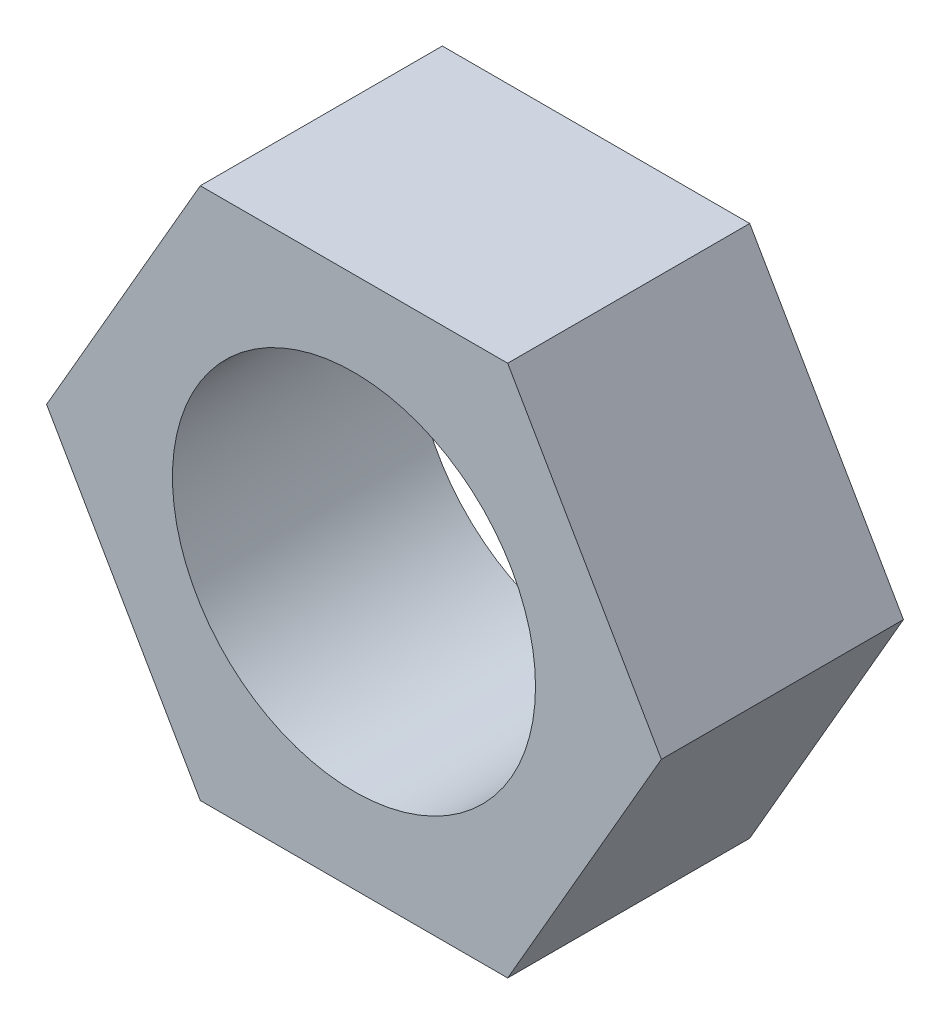
ISO-10303-21;
HEADER;
FILE_DESCRIPTION(('STEP AP214'),'2;1');
FILE_NAME('part.step','',(''),(''),'','','');
FILE_SCHEMA(('AUTOMOTIVE_DESIGN { 1 0 10303 214 1 1 1 1 }'));
ENDSEC;
DATA;
#1=APPLICATION_CONTEXT('core data for automotive mechanical design processes');
#2=APPLICATION_PROTOCOL_DEFINITION('international standard','automotive_design',2000,#1);
#3=PRODUCT_CONTEXT('',#1,'mechanical');
#4=PRODUCT('Part','Part','',(#3));
#5=PRODUCT_RELATED_PRODUCT_CATEGORY('part','',(#4));
#6=PRODUCT_DEFINITION_FORMATION('','',#4);
#7=PRODUCT_DEFINITION_CONTEXT('part definition',#1,'design');
#8=PRODUCT_DEFINITION('design','',#6,#7);
#9=PRODUCT_DEFINITION_SHAPE('','',#8);
#10=(LENGTH_UNIT() NAMED_UNIT(*) SI_UNIT(.MILLI.,.METRE.));
#11=(NAMED_UNIT(*) PLANE_ANGLE_UNIT() SI_UNIT($,.RADIAN.));
#12=(NAMED_UNIT(*) SI_UNIT($,.STERADIAN.) SOLID_ANGLE_UNIT());
#13=UNCERTAINTY_MEASURE_WITH_UNIT(LENGTH_MEASURE(1.E-05),#10,'distance_accuracy_value','');
#14=(GEOMETRIC_REPRESENTATION_CONTEXT(3) GLOBAL_UNCERTAINTY_ASSIGNED_CONTEXT((#13)) GLOBAL_UNIT_ASSIGNED_CONTEXT((#10,
#11,#12)) REPRESENTATION_CONTEXT('',''));
#15=CARTESIAN_POINT('',(0.,0.,0.));
#16=DIRECTION('',(0.,0.,1.));
#17=DIRECTION('',(1.,0.,0.));
#18=AXIS2_PLACEMENT_3D('',#15,#16,#17);
#19=CARTESIAN_POINT('',(0.,0.,2.));
#20=DIRECTION('',(0.,0.,1.));
#21=DIRECTION('',(1.,0.,0.));
#22=AXIS2_PLACEMENT_3D('',#19,#20,#21);
#23=PLANE('',#22);
#24=DIRECTION('',(-0.5,0.866025403784439,0.));
#25=VECTOR('',#24,1.);
#26=CARTESIAN_POINT('',(2.54,0.,2.));
#27=LINE('',#26,#25);
#28=CARTESIAN_POINT('',(2.54,0.,2.));
#29=VERTEX_POINT('',#28);
#30=CARTESIAN_POINT('',(1.27,2.19970452561247,2.));
#31=VERTEX_POINT('',#30);
#32=EDGE_CURVE('E152',#29,#31,#27,.T.);
#33=ORIENTED_EDGE('',*,*,#32,.T.);
#34=DIRECTION('',(-1.,0.,0.));
#35=VECTOR('',#34,1.);
#36=CARTESIAN_POINT('',(1.27,2.19970452561247,2.));
#37=LINE('',#36,#35);
#38=CARTESIAN_POINT('',(-1.27,2.19970452561247,2.));
#39=VERTEX_POINT('',#38);
#40=EDGE_CURVE('E100',#31,#39,#37,.T.);
#41=ORIENTED_EDGE('',*,*,#40,.T.);
#42=DIRECTION('',(-0.5,-0.866025403784439,0.));
#43=VECTOR('',#42,1.);
#44=CARTESIAN_POINT('',(-1.27,2.19970452561247,2.));
#45=LINE('',#44,#43);
#46=CARTESIAN_POINT('',(-2.54,0.,2.));
#47=VERTEX_POINT('',#46);
#48=EDGE_CURVE('E113',#39,#47,#45,.T.);
#49=ORIENTED_EDGE('',*,*,#48,.T.);
#50=DIRECTION('',(0.5,-0.866025403784439,0.));
#51=VECTOR('',#50,1.);
#52=CARTESIAN_POINT('',(-2.54,0.,2.));
#53=LINE('',#52,#51);
#54=CARTESIAN_POINT('',(-1.27,-2.19970452561247,2.));
#55=VERTEX_POINT('',#54);
#56=EDGE_CURVE('E107',#47,#55,#53,.T.);
#57=ORIENTED_EDGE('',*,*,#56,.T.);
#58=DIRECTION('',(1.,0.,0.));
#59=VECTOR('',#58,1.);
#60=CARTESIAN_POINT('',(-1.27,-2.19970452561247,2.));
#61=LINE('',#60,#59);
#62=CARTESIAN_POINT('',(1.27,-2.19970452561247,2.));
#63=VERTEX_POINT('',#62);
#64=EDGE_CURVE('E111',#55,#63,#61,.T.);
#65=ORIENTED_EDGE('',*,*,#64,.T.);
#66=DIRECTION('',(0.5,0.866025403784439,0.));
#67=VECTOR('',#66,1.);
#68=CARTESIAN_POINT('',(1.27,-2.19970452561247,2.));
#69=LINE('',#68,#67);
#70=EDGE_CURVE('E63',#63,#29,#69,.T.);
#71=ORIENTED_EDGE('',*,*,#70,.T.);
#72=EDGE_LOOP('',(#33,#41,#49,#57,#65,#71));
#73=FACE_BOUND('',#72,.T.);
#74=CARTESIAN_POINT('',(0.,0.,2.));
#75=DIRECTION('',(0.,0.,1.));
#76=DIRECTION('',(1.,0.,0.));
#77=AXIS2_PLACEMENT_3D('',#74,#75,#76);
#78=CIRCLE('',#77,1.5);
#79=CARTESIAN_POINT('',(1.5,0.,2.));
#80=VERTEX_POINT('',#79);
#81=EDGE_CURVE('E140',#80,#80,#78,.T.);
#82=ORIENTED_EDGE('',*,*,#81,.F.);
#83=EDGE_LOOP('',(#82));
#84=FACE_BOUND('',#83,.T.);
#85=ADVANCED_FACE('F45',(#73,#84),#23,.T.);
#86=CARTESIAN_POINT('',(0.,0.,0.));
#87=DIRECTION('',(0.,0.,1.));
#88=DIRECTION('',(1.,0.,0.));
#89=AXIS2_PLACEMENT_3D('',#86,#87,#88);
#90=PLANE('',#89);
#91=DIRECTION('',(-0.5,0.866025403784439,0.));
#92=VECTOR('',#91,1.);
#93=CARTESIAN_POINT('',(2.54,0.,0.));
#94=LINE('',#93,#92);
#95=CARTESIAN_POINT('',(2.54,0.,0.));
#96=VERTEX_POINT('',#95);
#97=CARTESIAN_POINT('',(1.27,2.19970452561247,0.));
#98=VERTEX_POINT('',#97);
#99=EDGE_CURVE('E135',#96,#98,#94,.T.);
#100=ORIENTED_EDGE('',*,*,#99,.F.);
#101=DIRECTION('',(0.5,0.866025403784439,0.));
#102=VECTOR('',#101,1.);
#103=CARTESIAN_POINT('',(1.27,-2.19970452561247,0.));
#104=LINE('',#103,#102);
#105=CARTESIAN_POINT('',(1.27,-2.19970452561247,0.));
#106=VERTEX_POINT('',#105);
#107=EDGE_CURVE('E92',#106,#96,#104,.T.);
#108=ORIENTED_EDGE('',*,*,#107,.F.);
#109=DIRECTION('',(1.,0.,0.));
#110=VECTOR('',#109,1.);
#111=CARTESIAN_POINT('',(-1.27,-2.19970452561247,0.));
#112=LINE('',#111,#110);
#113=CARTESIAN_POINT('',(-1.27,-2.19970452561247,0.));
#114=VERTEX_POINT('',#113);
#115=EDGE_CURVE('E86',#114,#106,#112,.T.);
#116=ORIENTED_EDGE('',*,*,#115,.F.);
#117=DIRECTION('',(0.5,-0.866025403784439,0.));
#118=VECTOR('',#117,1.);
#119=CARTESIAN_POINT('',(-2.54,0.,0.));
#120=LINE('',#119,#118);
#121=CARTESIAN_POINT('',(-2.54,0.,0.));
#122=VERTEX_POINT('',#121);
#123=EDGE_CURVE('E122',#122,#114,#120,.T.);
#124=ORIENTED_EDGE('',*,*,#123,.F.);
#125=DIRECTION('',(-0.5,-0.866025403784439,0.));
#126=VECTOR('',#125,1.);
#127=CARTESIAN_POINT('',(-1.27,2.19970452561247,0.));
#128=LINE('',#127,#126);
#129=CARTESIAN_POINT('',(-1.27,2.19970452561247,0.));
#130=VERTEX_POINT('',#129);
#131=EDGE_CURVE('E143',#130,#122,#128,.T.);
#132=ORIENTED_EDGE('',*,*,#131,.F.);
#133=DIRECTION('',(-1.,0.,0.));
#134=VECTOR('',#133,1.);
#135=CARTESIAN_POINT('',(1.27,2.19970452561247,0.));
#136=LINE('',#135,#134);
#137=EDGE_CURVE('E139',#98,#130,#136,.T.);
#138=ORIENTED_EDGE('',*,*,#137,.F.);
#139=EDGE_LOOP('',(#100,#108,#116,#124,#132,#138));
#140=FACE_BOUND('',#139,.T.);
#141=CARTESIAN_POINT('',(0.,0.,0.));
#142=DIRECTION('',(0.,0.,1.));
#143=DIRECTION('',(1.,0.,0.));
#144=AXIS2_PLACEMENT_3D('',#141,#142,#143);
#145=CIRCLE('',#144,1.5);
#146=CARTESIAN_POINT('',(1.5,0.,0.));
#147=VERTEX_POINT('',#146);
#148=EDGE_CURVE('E249',#147,#147,#145,.T.);
#149=ORIENTED_EDGE('',*,*,#148,.T.);
#150=EDGE_LOOP('',(#149));
#151=FACE_BOUND('',#150,.T.);
#152=ADVANCED_FACE('F165',(#140,#151),#90,.F.);
#153=CARTESIAN_POINT('',(2.54,0.,2.));
#154=DIRECTION('',(-0.866025403784439,-0.5,0.));
#155=DIRECTION('',(0.5,-0.866025403784439,0.));
#156=AXIS2_PLACEMENT_3D('',#153,#154,#155);
#157=PLANE('',#156);
#158=ORIENTED_EDGE('',*,*,#99,.T.);
#159=DIRECTION('',(0.,0.,-1.));
#160=VECTOR('',#159,1.);
#161=CARTESIAN_POINT('',(1.27,2.19970452561247,2.));
#162=LINE('',#161,#160);
#163=EDGE_CURVE('E11',#31,#98,#162,.T.);
#164=ORIENTED_EDGE('',*,*,#163,.F.);
#165=ORIENTED_EDGE('',*,*,#32,.F.);
#166=DIRECTION('',(0.,0.,-1.));
#167=VECTOR('',#166,1.);
#168=CARTESIAN_POINT('',(2.54,0.,2.));
#169=LINE('',#168,#167);
#170=EDGE_CURVE('E131',#29,#96,#169,.T.);
#171=ORIENTED_EDGE('',*,*,#170,.T.);
#172=EDGE_LOOP('',(#158,#164,#165,#171));
#173=FACE_BOUND('',#172,.T.);
#174=ADVANCED_FACE('F47',(#173),#157,.F.);
#175=CARTESIAN_POINT('',(1.27,2.19970452561247,2.));
#176=DIRECTION('',(0.,-1.,0.));
#177=DIRECTION('',(0.,0.,-1.));
#178=AXIS2_PLACEMENT_3D('',#175,#176,#177);
#179=PLANE('',#178);
#180=ORIENTED_EDGE('',*,*,#137,.T.);
#181=DIRECTION('',(0.,0.,-1.));
#182=VECTOR('',#181,1.);
#183=CARTESIAN_POINT('',(-1.27,2.19970452561247,2.));
#184=LINE('',#183,#182);
#185=EDGE_CURVE('E55',#39,#130,#184,.T.);
#186=ORIENTED_EDGE('',*,*,#185,.F.);
#187=ORIENTED_EDGE('',*,*,#40,.F.);
#188=ORIENTED_EDGE('',*,*,#163,.T.);
#189=EDGE_LOOP('',(#180,#186,#187,#188));
#190=FACE_BOUND('',#189,.T.);
#191=ADVANCED_FACE('F190',(#190),#179,.F.);
#192=CARTESIAN_POINT('',(-1.27,2.19970452561247,2.));
#193=DIRECTION('',(0.866025403784439,-0.5,0.));
#194=DIRECTION('',(0.5,0.866025403784439,0.));
#195=AXIS2_PLACEMENT_3D('',#192,#193,#194);
#196=PLANE('',#195);
#197=ORIENTED_EDGE('',*,*,#131,.T.);
#198=DIRECTION('',(0.,0.,-1.));
#199=VECTOR('',#198,1.);
#200=CARTESIAN_POINT('',(-2.54,0.,2.));
#201=LINE('',#200,#199);
#202=EDGE_CURVE('E124',#47,#122,#201,.T.);
#203=ORIENTED_EDGE('',*,*,#202,.F.);
#204=ORIENTED_EDGE('',*,*,#48,.F.);
#205=ORIENTED_EDGE('',*,*,#185,.T.);
#206=EDGE_LOOP('',(#197,#203,#204,#205));
#207=FACE_BOUND('',#206,.T.);
#208=ADVANCED_FACE('F162',(#207),#196,.F.);
#209=CARTESIAN_POINT('',(-2.54,0.,2.));
#210=DIRECTION('',(0.866025403784439,0.5,0.));
#211=DIRECTION('',(-0.5,0.866025403784439,0.));
#212=AXIS2_PLACEMENT_3D('',#209,#210,#211);
#213=PLANE('',#212);
#214=ORIENTED_EDGE('',*,*,#123,.T.);
#215=DIRECTION('',(0.,0.,-1.));
#216=VECTOR('',#215,1.);
#217=CARTESIAN_POINT('',(-1.27,-2.19970452561247,2.));
#218=LINE('',#217,#216);
#219=EDGE_CURVE('E119',#55,#114,#218,.T.);
#220=ORIENTED_EDGE('',*,*,#219,.F.);
#221=ORIENTED_EDGE('',*,*,#56,.F.);
#222=ORIENTED_EDGE('',*,*,#202,.T.);
#223=EDGE_LOOP('',(#214,#220,#221,#222));
#224=FACE_BOUND('',#223,.T.);
#225=ADVANCED_FACE('F120',(#224),#213,.F.);
#226=CARTESIAN_POINT('',(-1.27,-2.19970452561247,2.));
#227=DIRECTION('',(0.,1.,0.));
#228=DIRECTION('',(-1.,0.,0.));
#229=AXIS2_PLACEMENT_3D('',#226,#227,#228);
#230=PLANE('',#229);
#231=ORIENTED_EDGE('',*,*,#115,.T.);
#232=DIRECTION('',(0.,0.,-1.));
#233=VECTOR('',#232,1.);
#234=CARTESIAN_POINT('',(1.27,-2.19970452561247,2.));
#235=LINE('',#234,#233);
#236=EDGE_CURVE('E125',#63,#106,#235,.T.);
#237=ORIENTED_EDGE('',*,*,#236,.F.);
#238=ORIENTED_EDGE('',*,*,#64,.F.);
#239=ORIENTED_EDGE('',*,*,#219,.T.);
#240=EDGE_LOOP('',(#231,#237,#238,#239));
#241=FACE_BOUND('',#240,.T.);
#242=ADVANCED_FACE('F127',(#241),#230,.F.);
#243=CARTESIAN_POINT('',(1.27,-2.19970452561247,2.));
#244=DIRECTION('',(-0.866025403784439,0.5,0.));
#245=DIRECTION('',(-0.5,-0.866025403784439,0.));
#246=AXIS2_PLACEMENT_3D('',#243,#244,#245);
#247=PLANE('',#246);
#248=ORIENTED_EDGE('',*,*,#107,.T.);
#249=ORIENTED_EDGE('',*,*,#170,.F.);
#250=ORIENTED_EDGE('',*,*,#70,.F.);
#251=ORIENTED_EDGE('',*,*,#236,.T.);
#252=EDGE_LOOP('',(#248,#249,#250,#251));
#253=FACE_BOUND('',#252,.T.);
#254=ADVANCED_FACE('F170',(#253),#247,.F.);
#255=CARTESIAN_POINT('',(0.,0.,2.));
#256=DIRECTION('',(0.,0.,-1.));
#257=DIRECTION('',(-1.,0.,0.));
#258=AXIS2_PLACEMENT_3D('',#255,#256,#257);
#259=CYLINDRICAL_SURFACE('',#258,1.5);
#260=ORIENTED_EDGE('',*,*,#81,.T.);
#261=EDGE_LOOP('',(#260));
#262=FACE_BOUND('',#261,.T.);
#263=ORIENTED_EDGE('',*,*,#148,.F.);
#264=EDGE_LOOP('',(#263));
#265=FACE_BOUND('',#264,.T.);
#266=ADVANCED_FACE('F172',(#262,#265),#259,.F.);
#267=CLOSED_SHELL('',(#85,#152,#174,#191,#208,#225,#242,#254,#266));
#268=MANIFOLD_SOLID_BREP('B2',#267);
#269=ADVANCED_BREP_SHAPE_REPRESENTATION('',(#18,#268),#14);
#270=SHAPE_DEFINITION_REPRESENTATION(#9,#269);
ENDSEC;
END-ISO-10303-21;
